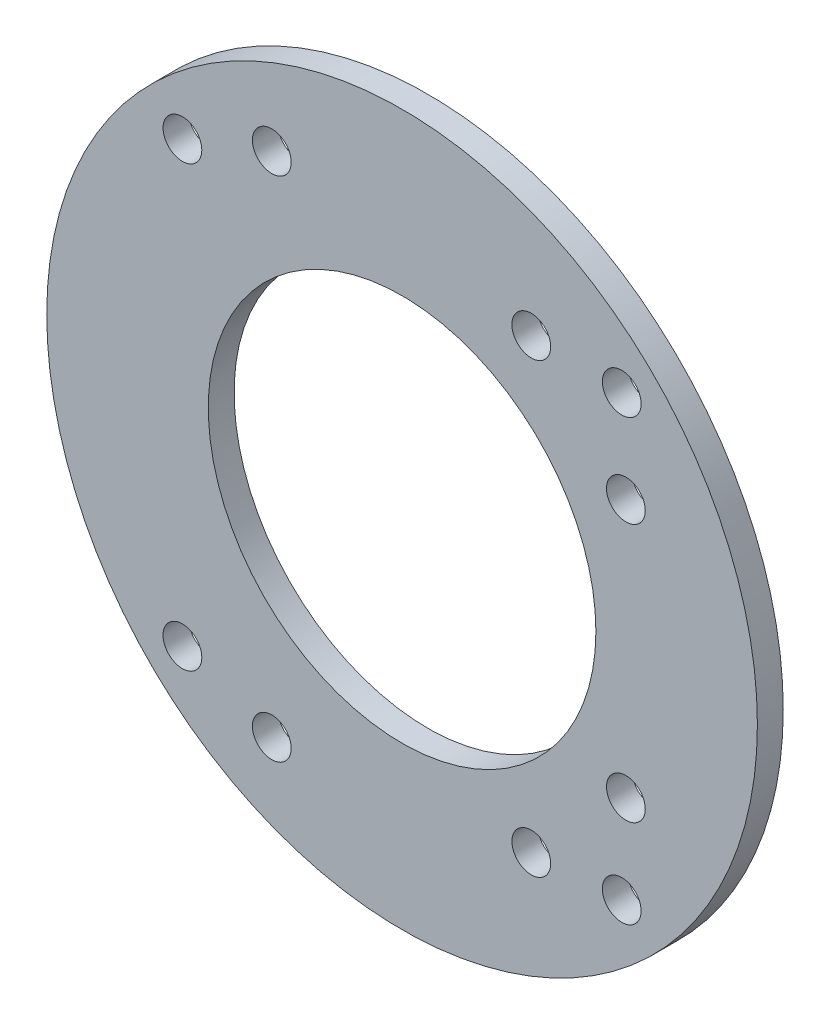
ISO-10303-21;
HEADER;
FILE_DESCRIPTION(('STEP AP214'),'2;1');
FILE_NAME('part.step','',(''),(''),'','','');
FILE_SCHEMA(('AUTOMOTIVE_DESIGN { 1 0 10303 214 1 1 1 1 }'));
ENDSEC;
DATA;
#1=APPLICATION_CONTEXT('core data for automotive mechanical design processes');
#2=APPLICATION_PROTOCOL_DEFINITION('international standard','automotive_design',2000,#1);
#3=PRODUCT_CONTEXT('',#1,'mechanical');
#4=PRODUCT('Part','Part','',(#3));
#5=PRODUCT_RELATED_PRODUCT_CATEGORY('part','',(#4));
#6=PRODUCT_DEFINITION_FORMATION('','',#4);
#7=PRODUCT_DEFINITION_CONTEXT('part definition',#1,'design');
#8=PRODUCT_DEFINITION('design','',#6,#7);
#9=PRODUCT_DEFINITION_SHAPE('','',#8);
#10=(LENGTH_UNIT() NAMED_UNIT(*) SI_UNIT(.MILLI.,.METRE.));
#11=(NAMED_UNIT(*) PLANE_ANGLE_UNIT() SI_UNIT($,.RADIAN.));
#12=(NAMED_UNIT(*) SI_UNIT($,.STERADIAN.) SOLID_ANGLE_UNIT());
#13=UNCERTAINTY_MEASURE_WITH_UNIT(LENGTH_MEASURE(1.E-05),#10,'distance_accuracy_value','');
#14=(GEOMETRIC_REPRESENTATION_CONTEXT(3) GLOBAL_UNCERTAINTY_ASSIGNED_CONTEXT((#13)) GLOBAL_UNIT_ASSIGNED_CONTEXT((#10,
#11,#12)) REPRESENTATION_CONTEXT('',''));
#15=CARTESIAN_POINT('',(0.,0.,0.));
#16=DIRECTION('',(0.,0.,1.));
#17=DIRECTION('',(1.,0.,0.));
#18=AXIS2_PLACEMENT_3D('',#15,#16,#17);
#19=CARTESIAN_POINT('',(139.99999999915,1.51212375953946E-09,2.));
#20=DIRECTION('',(0.,0.,-1.));
#21=DIRECTION('',(-1.,0.,0.));
#22=AXIS2_PLACEMENT_3D('',#19,#20,#21);
#23=CYLINDRICAL_SURFACE('',#22,27.5);
#24=CARTESIAN_POINT('',(139.99999999915,1.51212375953946E-09,2.));
#25=DIRECTION('',(0.,0.,1.));
#26=DIRECTION('',(1.,0.,0.));
#27=AXIS2_PLACEMENT_3D('',#24,#25,#26);
#28=CIRCLE('',#27,27.5);
#29=CARTESIAN_POINT('',(167.49999999915,1.51212375953946E-09,2.));
#30=VERTEX_POINT('',#29);
#31=EDGE_CURVE('E49',#30,#30,#28,.T.);
#32=ORIENTED_EDGE('',*,*,#31,.F.);
#33=EDGE_LOOP('',(#32));
#34=FACE_BOUND('',#33,.T.);
#35=CARTESIAN_POINT('',(139.99999999915,1.51212375953946E-09,0.));
#36=DIRECTION('',(0.,0.,1.));
#37=DIRECTION('',(1.,0.,0.));
#38=AXIS2_PLACEMENT_3D('',#35,#36,#37);
#39=CIRCLE('',#38,27.5);
#40=CARTESIAN_POINT('',(167.49999999915,1.51212375953946E-09,0.));
#41=VERTEX_POINT('',#40);
#42=EDGE_CURVE('E87',#41,#41,#39,.T.);
#43=ORIENTED_EDGE('',*,*,#42,.T.);
#44=EDGE_LOOP('',(#43));
#45=FACE_BOUND('',#44,.T.);
#46=ADVANCED_FACE('F41',(#34,#45),#23,.T.);
#47=CARTESIAN_POINT('',(129.917171064338,19.6398989681114,2.));
#48=DIRECTION('',(0.,0.,-1.));
#49=DIRECTION('',(-1.,0.,0.));
#50=AXIS2_PLACEMENT_3D('',#47,#48,#49);
#51=CYLINDRICAL_SURFACE('',#50,1.5);
#52=CARTESIAN_POINT('',(129.917171064338,19.6398989681114,2.));
#53=DIRECTION('',(0.,0.,1.));
#54=DIRECTION('',(1.,0.,0.));
#55=AXIS2_PLACEMENT_3D('',#52,#53,#54);
#56=CIRCLE('',#55,1.5);
#57=CARTESIAN_POINT('',(131.417171064338,19.6398989681114,2.));
#58=VERTEX_POINT('',#57);
#59=EDGE_CURVE('E54',#58,#58,#56,.T.);
#60=ORIENTED_EDGE('',*,*,#59,.T.);
#61=EDGE_LOOP('',(#60));
#62=FACE_BOUND('',#61,.T.);
#63=CARTESIAN_POINT('',(129.917171064338,19.6398989681114,0.));
#64=DIRECTION('',(0.,0.,1.));
#65=DIRECTION('',(1.,0.,0.));
#66=AXIS2_PLACEMENT_3D('',#63,#64,#65);
#67=CIRCLE('',#66,1.5);
#68=CARTESIAN_POINT('',(131.417171064338,19.6398989681114,0.));
#69=VERTEX_POINT('',#68);
#70=EDGE_CURVE('E85',#69,#69,#67,.T.);
#71=ORIENTED_EDGE('',*,*,#70,.F.);
#72=EDGE_LOOP('',(#71));
#73=FACE_BOUND('',#72,.T.);
#74=ADVANCED_FACE('F126',(#62,#73),#51,.F.);
#75=CARTESIAN_POINT('',(129.917171064338,-19.6398989651158,2.));
#76=DIRECTION('',(0.,0.,-1.));
#77=DIRECTION('',(-1.,0.,0.));
#78=AXIS2_PLACEMENT_3D('',#75,#76,#77);
#79=CYLINDRICAL_SURFACE('',#78,1.5);
#80=CARTESIAN_POINT('',(129.917171064338,-19.6398989651158,2.));
#81=DIRECTION('',(0.,0.,1.));
#82=DIRECTION('',(1.,0.,0.));
#83=AXIS2_PLACEMENT_3D('',#80,#81,#82);
#84=CIRCLE('',#83,1.5);
#85=CARTESIAN_POINT('',(131.417171064338,-19.6398989651158,2.));
#86=VERTEX_POINT('',#85);
#87=EDGE_CURVE('E121',#86,#86,#84,.T.);
#88=ORIENTED_EDGE('',*,*,#87,.T.);
#89=EDGE_LOOP('',(#88));
#90=FACE_BOUND('',#89,.T.);
#91=CARTESIAN_POINT('',(129.917171064338,-19.6398989651158,0.));
#92=DIRECTION('',(0.,0.,1.));
#93=DIRECTION('',(1.,0.,0.));
#94=AXIS2_PLACEMENT_3D('',#91,#92,#93);
#95=CIRCLE('',#94,1.5);
#96=CARTESIAN_POINT('',(131.417171064338,-19.6398989651158,0.));
#97=VERTEX_POINT('',#96);
#98=EDGE_CURVE('E82',#97,#97,#95,.T.);
#99=ORIENTED_EDGE('',*,*,#98,.F.);
#100=EDGE_LOOP('',(#99));
#101=FACE_BOUND('',#100,.T.);
#102=ADVANCED_FACE('F144',(#90,#101),#79,.F.);
#103=CARTESIAN_POINT('',(157.320508074845,10.0000000014985,2.));
#104=DIRECTION('',(0.,0.,-1.));
#105=DIRECTION('',(-1.,0.,0.));
#106=AXIS2_PLACEMENT_3D('',#103,#104,#105);
#107=CYLINDRICAL_SURFACE('',#106,1.50000000000003);
#108=CARTESIAN_POINT('',(157.320508074845,10.0000000014985,2.));
#109=DIRECTION('',(0.,0.,1.));
#110=DIRECTION('',(1.,0.,0.));
#111=AXIS2_PLACEMENT_3D('',#108,#109,#110);
#112=CIRCLE('',#111,1.50000000000003);
#113=CARTESIAN_POINT('',(158.820508074845,10.0000000014985,2.));
#114=VERTEX_POINT('',#113);
#115=EDGE_CURVE('E118',#114,#114,#112,.T.);
#116=ORIENTED_EDGE('',*,*,#115,.T.);
#117=EDGE_LOOP('',(#116));
#118=FACE_BOUND('',#117,.T.);
#119=CARTESIAN_POINT('',(157.320508074845,10.0000000014985,0.));
#120=DIRECTION('',(0.,0.,1.));
#121=DIRECTION('',(1.,0.,0.));
#122=AXIS2_PLACEMENT_3D('',#119,#120,#121);
#123=CIRCLE('',#122,1.50000000000003);
#124=CARTESIAN_POINT('',(158.820508074845,10.0000000014985,0.));
#125=VERTEX_POINT('',#124);
#126=EDGE_CURVE('E79',#125,#125,#123,.T.);
#127=ORIENTED_EDGE('',*,*,#126,.F.);
#128=EDGE_LOOP('',(#127));
#129=FACE_BOUND('',#128,.T.);
#130=ADVANCED_FACE('F151',(#118,#129),#107,.F.);
#131=CARTESIAN_POINT('',(156.99999999915,17.0000000015121,2.));
#132=DIRECTION('',(0.,0.,-1.));
#133=DIRECTION('',(-1.,0.,0.));
#134=AXIS2_PLACEMENT_3D('',#131,#132,#133);
#135=CYLINDRICAL_SURFACE('',#134,1.5);
#136=CARTESIAN_POINT('',(156.99999999915,17.0000000015121,2.));
#137=DIRECTION('',(0.,0.,1.));
#138=DIRECTION('',(1.,0.,0.));
#139=AXIS2_PLACEMENT_3D('',#136,#137,#138);
#140=CIRCLE('',#139,1.5);
#141=CARTESIAN_POINT('',(158.49999999915,17.0000000015121,2.));
#142=VERTEX_POINT('',#141);
#143=EDGE_CURVE('E115',#142,#142,#140,.T.);
#144=ORIENTED_EDGE('',*,*,#143,.T.);
#145=EDGE_LOOP('',(#144));
#146=FACE_BOUND('',#145,.T.);
#147=CARTESIAN_POINT('',(156.99999999915,17.0000000015121,0.));
#148=DIRECTION('',(0.,0.,1.));
#149=DIRECTION('',(1.,0.,0.));
#150=AXIS2_PLACEMENT_3D('',#147,#148,#149);
#151=CIRCLE('',#150,1.5);
#152=CARTESIAN_POINT('',(158.49999999915,17.0000000015121,0.));
#153=VERTEX_POINT('',#152);
#154=EDGE_CURVE('E76',#153,#153,#151,.T.);
#155=ORIENTED_EDGE('',*,*,#154,.F.);
#156=EDGE_LOOP('',(#155));
#157=FACE_BOUND('',#156,.T.);
#158=ADVANCED_FACE('F155',(#146,#157),#135,.F.);
#159=CARTESIAN_POINT('',(149.999999999156,17.320508077187,2.));
#160=DIRECTION('',(0.,0.,-1.));
#161=DIRECTION('',(-1.,0.,0.));
#162=AXIS2_PLACEMENT_3D('',#159,#160,#161);
#163=CYLINDRICAL_SURFACE('',#162,1.5);
#164=CARTESIAN_POINT('',(149.999999999156,17.320508077187,2.));
#165=DIRECTION('',(0.,0.,1.));
#166=DIRECTION('',(1.,0.,0.));
#167=AXIS2_PLACEMENT_3D('',#164,#165,#166);
#168=CIRCLE('',#167,1.5);
#169=CARTESIAN_POINT('',(151.499999999156,17.320508077187,2.));
#170=VERTEX_POINT('',#169);
#171=EDGE_CURVE('E112',#170,#170,#168,.T.);
#172=ORIENTED_EDGE('',*,*,#171,.T.);
#173=EDGE_LOOP('',(#172));
#174=FACE_BOUND('',#173,.T.);
#175=CARTESIAN_POINT('',(149.999999999156,17.320508077187,0.));
#176=DIRECTION('',(0.,0.,1.));
#177=DIRECTION('',(1.,0.,0.));
#178=AXIS2_PLACEMENT_3D('',#175,#176,#177);
#179=CIRCLE('',#178,1.5);
#180=CARTESIAN_POINT('',(151.499999999156,17.320508077187,0.));
#181=VERTEX_POINT('',#180);
#182=EDGE_CURVE('E73',#181,#181,#179,.T.);
#183=ORIENTED_EDGE('',*,*,#182,.F.);
#184=EDGE_LOOP('',(#183));
#185=FACE_BOUND('',#184,.T.);
#186=ADVANCED_FACE('F159',(#174,#185),#163,.F.);
#187=CARTESIAN_POINT('',(122.99999999915,17.0000000015121,2.));
#188=DIRECTION('',(0.,0.,-1.));
#189=DIRECTION('',(-1.,0.,0.));
#190=AXIS2_PLACEMENT_3D('',#187,#188,#189);
#191=CYLINDRICAL_SURFACE('',#190,1.5);
#192=CARTESIAN_POINT('',(122.99999999915,17.0000000015121,2.));
#193=DIRECTION('',(0.,0.,1.));
#194=DIRECTION('',(1.,0.,0.));
#195=AXIS2_PLACEMENT_3D('',#192,#193,#194);
#196=CIRCLE('',#195,1.5);
#197=CARTESIAN_POINT('',(124.49999999915,17.0000000015121,2.));
#198=VERTEX_POINT('',#197);
#199=EDGE_CURVE('E109',#198,#198,#196,.T.);
#200=ORIENTED_EDGE('',*,*,#199,.T.);
#201=EDGE_LOOP('',(#200));
#202=FACE_BOUND('',#201,.T.);
#203=CARTESIAN_POINT('',(122.99999999915,17.0000000015121,0.));
#204=DIRECTION('',(0.,0.,1.));
#205=DIRECTION('',(1.,0.,0.));
#206=AXIS2_PLACEMENT_3D('',#203,#204,#205);
#207=CIRCLE('',#206,1.5);
#208=CARTESIAN_POINT('',(124.49999999915,17.0000000015121,0.));
#209=VERTEX_POINT('',#208);
#210=EDGE_CURVE('E70',#209,#209,#207,.T.);
#211=ORIENTED_EDGE('',*,*,#210,.F.);
#212=EDGE_LOOP('',(#211));
#213=FACE_BOUND('',#212,.T.);
#214=ADVANCED_FACE('F163',(#202,#213),#191,.F.);
#215=CARTESIAN_POINT('',(122.99999999915,-16.9999999984879,2.));
#216=DIRECTION('',(0.,0.,-1.));
#217=DIRECTION('',(-1.,0.,0.));
#218=AXIS2_PLACEMENT_3D('',#215,#216,#217);
#219=CYLINDRICAL_SURFACE('',#218,1.5);
#220=CARTESIAN_POINT('',(122.99999999915,-16.9999999984879,2.));
#221=DIRECTION('',(0.,0.,1.));
#222=DIRECTION('',(1.,0.,0.));
#223=AXIS2_PLACEMENT_3D('',#220,#221,#222);
#224=CIRCLE('',#223,1.5);
#225=CARTESIAN_POINT('',(124.49999999915,-16.9999999984879,2.));
#226=VERTEX_POINT('',#225);
#227=EDGE_CURVE('E106',#226,#226,#224,.T.);
#228=ORIENTED_EDGE('',*,*,#227,.T.);
#229=EDGE_LOOP('',(#228));
#230=FACE_BOUND('',#229,.T.);
#231=CARTESIAN_POINT('',(122.99999999915,-16.9999999984879,0.));
#232=DIRECTION('',(0.,0.,1.));
#233=DIRECTION('',(1.,0.,0.));
#234=AXIS2_PLACEMENT_3D('',#231,#232,#233);
#235=CIRCLE('',#234,1.5);
#236=CARTESIAN_POINT('',(124.49999999915,-16.9999999984879,0.));
#237=VERTEX_POINT('',#236);
#238=EDGE_CURVE('E67',#237,#237,#235,.T.);
#239=ORIENTED_EDGE('',*,*,#238,.F.);
#240=EDGE_LOOP('',(#239));
#241=FACE_BOUND('',#240,.T.);
#242=ADVANCED_FACE('F167',(#230,#241),#219,.F.);
#243=CARTESIAN_POINT('',(149.999999999158,-17.3205080741906,2.));
#244=DIRECTION('',(0.,0.,-1.));
#245=DIRECTION('',(-1.,0.,0.));
#246=AXIS2_PLACEMENT_3D('',#243,#244,#245);
#247=CYLINDRICAL_SURFACE('',#246,1.50000000000003);
#248=CARTESIAN_POINT('',(149.999999999158,-17.3205080741906,2.));
#249=DIRECTION('',(0.,0.,1.));
#250=DIRECTION('',(1.,0.,0.));
#251=AXIS2_PLACEMENT_3D('',#248,#249,#250);
#252=CIRCLE('',#251,1.50000000000003);
#253=CARTESIAN_POINT('',(151.499999999158,-17.3205080741906,2.));
#254=VERTEX_POINT('',#253);
#255=EDGE_CURVE('E101',#254,#254,#252,.T.);
#256=ORIENTED_EDGE('',*,*,#255,.T.);
#257=EDGE_LOOP('',(#256));
#258=FACE_BOUND('',#257,.T.);
#259=CARTESIAN_POINT('',(149.999999999158,-17.3205080741906,0.));
#260=DIRECTION('',(0.,0.,1.));
#261=DIRECTION('',(1.,0.,0.));
#262=AXIS2_PLACEMENT_3D('',#259,#260,#261);
#263=CIRCLE('',#262,1.50000000000003);
#264=CARTESIAN_POINT('',(151.499999999158,-17.3205080741906,0.));
#265=VERTEX_POINT('',#264);
#266=EDGE_CURVE('E64',#265,#265,#263,.T.);
#267=ORIENTED_EDGE('',*,*,#266,.F.);
#268=EDGE_LOOP('',(#267));
#269=FACE_BOUND('',#268,.T.);
#270=ADVANCED_FACE('F171',(#258,#269),#247,.F.);
#271=CARTESIAN_POINT('',(156.99999999915,-16.9999999984879,2.));
#272=DIRECTION('',(0.,0.,-1.));
#273=DIRECTION('',(-1.,0.,0.));
#274=AXIS2_PLACEMENT_3D('',#271,#272,#273);
#275=CYLINDRICAL_SURFACE('',#274,1.5);
#276=CARTESIAN_POINT('',(156.99999999915,-16.9999999984879,2.));
#277=DIRECTION('',(0.,0.,1.));
#278=DIRECTION('',(1.,0.,0.));
#279=AXIS2_PLACEMENT_3D('',#276,#277,#278);
#280=CIRCLE('',#279,1.5);
#281=CARTESIAN_POINT('',(158.49999999915,-16.9999999984879,2.));
#282=VERTEX_POINT('',#281);
#283=EDGE_CURVE('E96',#282,#282,#280,.T.);
#284=ORIENTED_EDGE('',*,*,#283,.T.);
#285=EDGE_LOOP('',(#284));
#286=FACE_BOUND('',#285,.T.);
#287=CARTESIAN_POINT('',(156.99999999915,-16.9999999984879,0.));
#288=DIRECTION('',(0.,0.,1.));
#289=DIRECTION('',(1.,0.,0.));
#290=AXIS2_PLACEMENT_3D('',#287,#288,#289);
#291=CIRCLE('',#290,1.5);
#292=CARTESIAN_POINT('',(158.49999999915,-16.9999999984879,0.));
#293=VERTEX_POINT('',#292);
#294=EDGE_CURVE('E61',#293,#293,#291,.T.);
#295=ORIENTED_EDGE('',*,*,#294,.F.);
#296=EDGE_LOOP('',(#295));
#297=FACE_BOUND('',#296,.T.);
#298=ADVANCED_FACE('F174',(#286,#297),#275,.F.);
#299=CARTESIAN_POINT('',(157.320508074846,-9.99999999850157,2.));
#300=DIRECTION('',(0.,0.,-1.));
#301=DIRECTION('',(-1.,0.,0.));
#302=AXIS2_PLACEMENT_3D('',#299,#300,#301);
#303=CYLINDRICAL_SURFACE('',#302,1.5);
#304=CARTESIAN_POINT('',(157.320508074846,-9.99999999850157,2.));
#305=DIRECTION('',(0.,0.,1.));
#306=DIRECTION('',(1.,0.,0.));
#307=AXIS2_PLACEMENT_3D('',#304,#305,#306);
#308=CIRCLE('',#307,1.5);
#309=CARTESIAN_POINT('',(158.820508074846,-9.99999999850157,2.));
#310=VERTEX_POINT('',#309);
#311=EDGE_CURVE('E92',#310,#310,#308,.T.);
#312=ORIENTED_EDGE('',*,*,#311,.T.);
#313=EDGE_LOOP('',(#312));
#314=FACE_BOUND('',#313,.T.);
#315=CARTESIAN_POINT('',(157.320508074846,-9.99999999850157,0.));
#316=DIRECTION('',(0.,0.,1.));
#317=DIRECTION('',(1.,0.,0.));
#318=AXIS2_PLACEMENT_3D('',#315,#316,#317);
#319=CIRCLE('',#318,1.5);
#320=CARTESIAN_POINT('',(158.820508074846,-9.99999999850157,0.));
#321=VERTEX_POINT('',#320);
#322=EDGE_CURVE('E58',#321,#321,#319,.T.);
#323=ORIENTED_EDGE('',*,*,#322,.F.);
#324=EDGE_LOOP('',(#323));
#325=FACE_BOUND('',#324,.T.);
#326=ADVANCED_FACE('F43',(#314,#325),#303,.F.);
#327=CARTESIAN_POINT('',(139.99999999915,1.51212375953946E-09,2.));
#328=DIRECTION('',(0.,0.,-1.));
#329=DIRECTION('',(-1.,0.,0.));
#330=AXIS2_PLACEMENT_3D('',#327,#328,#329);
#331=CYLINDRICAL_SURFACE('',#330,15.);
#332=CARTESIAN_POINT('',(139.99999999915,1.51212375953946E-09,2.));
#333=DIRECTION('',(0.,0.,1.));
#334=DIRECTION('',(1.,0.,0.));
#335=AXIS2_PLACEMENT_3D('',#332,#333,#334);
#336=CIRCLE('',#335,15.);
#337=CARTESIAN_POINT('',(154.99999999915,1.51212375953946E-09,2.));
#338=VERTEX_POINT('',#337);
#339=EDGE_CURVE('E10',#338,#338,#336,.T.);
#340=ORIENTED_EDGE('',*,*,#339,.T.);
#341=EDGE_LOOP('',(#340));
#342=FACE_BOUND('',#341,.T.);
#343=CARTESIAN_POINT('',(139.99999999915,1.51212375953946E-09,0.));
#344=DIRECTION('',(0.,0.,1.));
#345=DIRECTION('',(1.,0.,0.));
#346=AXIS2_PLACEMENT_3D('',#343,#344,#345);
#347=CIRCLE('',#346,15.);
#348=CARTESIAN_POINT('',(154.99999999915,1.51212375953946E-09,0.));
#349=VERTEX_POINT('',#348);
#350=EDGE_CURVE('E45',#349,#349,#347,.T.);
#351=ORIENTED_EDGE('',*,*,#350,.F.);
#352=EDGE_LOOP('',(#351));
#353=FACE_BOUND('',#352,.T.);
#354=ADVANCED_FACE('F133',(#342,#353),#331,.F.);
#355=CARTESIAN_POINT('',(0.,0.,2.));
#356=DIRECTION('',(0.,0.,1.));
#357=DIRECTION('',(1.,0.,0.));
#358=AXIS2_PLACEMENT_3D('',#355,#356,#357);
#359=PLANE('',#358);
#360=ORIENTED_EDGE('',*,*,#311,.F.);
#361=EDGE_LOOP('',(#360));
#362=FACE_BOUND('',#361,.T.);
#363=ORIENTED_EDGE('',*,*,#283,.F.);
#364=EDGE_LOOP('',(#363));
#365=FACE_BOUND('',#364,.T.);
#366=ORIENTED_EDGE('',*,*,#255,.F.);
#367=EDGE_LOOP('',(#366));
#368=FACE_BOUND('',#367,.T.);
#369=ORIENTED_EDGE('',*,*,#227,.F.);
#370=EDGE_LOOP('',(#369));
#371=FACE_BOUND('',#370,.T.);
#372=ORIENTED_EDGE('',*,*,#199,.F.);
#373=EDGE_LOOP('',(#372));
#374=FACE_BOUND('',#373,.T.);
#375=ORIENTED_EDGE('',*,*,#171,.F.);
#376=EDGE_LOOP('',(#375));
#377=FACE_BOUND('',#376,.T.);
#378=ORIENTED_EDGE('',*,*,#143,.F.);
#379=EDGE_LOOP('',(#378));
#380=FACE_BOUND('',#379,.T.);
#381=ORIENTED_EDGE('',*,*,#115,.F.);
#382=EDGE_LOOP('',(#381));
#383=FACE_BOUND('',#382,.T.);
#384=ORIENTED_EDGE('',*,*,#87,.F.);
#385=EDGE_LOOP('',(#384));
#386=FACE_BOUND('',#385,.T.);
#387=ORIENTED_EDGE('',*,*,#59,.F.);
#388=EDGE_LOOP('',(#387));
#389=FACE_BOUND('',#388,.T.);
#390=ORIENTED_EDGE('',*,*,#31,.T.);
#391=EDGE_LOOP('',(#390));
#392=FACE_BOUND('',#391,.T.);
#393=ORIENTED_EDGE('',*,*,#339,.F.);
#394=EDGE_LOOP('',(#393));
#395=FACE_BOUND('',#394,.T.);
#396=ADVANCED_FACE('F129',(#362,#365,#368,#371,#374,#377,#380,#383,#386,#389,#392,#395),#359,.T.);
#397=CARTESIAN_POINT('',(0.,0.,0.));
#398=DIRECTION('',(0.,0.,1.));
#399=DIRECTION('',(1.,0.,0.));
#400=AXIS2_PLACEMENT_3D('',#397,#398,#399);
#401=PLANE('',#400);
#402=ORIENTED_EDGE('',*,*,#322,.T.);
#403=EDGE_LOOP('',(#402));
#404=FACE_BOUND('',#403,.T.);
#405=ORIENTED_EDGE('',*,*,#294,.T.);
#406=EDGE_LOOP('',(#405));
#407=FACE_BOUND('',#406,.T.);
#408=ORIENTED_EDGE('',*,*,#266,.T.);
#409=EDGE_LOOP('',(#408));
#410=FACE_BOUND('',#409,.T.);
#411=ORIENTED_EDGE('',*,*,#238,.T.);
#412=EDGE_LOOP('',(#411));
#413=FACE_BOUND('',#412,.T.);
#414=ORIENTED_EDGE('',*,*,#210,.T.);
#415=EDGE_LOOP('',(#414));
#416=FACE_BOUND('',#415,.T.);
#417=ORIENTED_EDGE('',*,*,#182,.T.);
#418=EDGE_LOOP('',(#417));
#419=FACE_BOUND('',#418,.T.);
#420=ORIENTED_EDGE('',*,*,#154,.T.);
#421=EDGE_LOOP('',(#420));
#422=FACE_BOUND('',#421,.T.);
#423=ORIENTED_EDGE('',*,*,#126,.T.);
#424=EDGE_LOOP('',(#423));
#425=FACE_BOUND('',#424,.T.);
#426=ORIENTED_EDGE('',*,*,#98,.T.);
#427=EDGE_LOOP('',(#426));
#428=FACE_BOUND('',#427,.T.);
#429=ORIENTED_EDGE('',*,*,#70,.T.);
#430=EDGE_LOOP('',(#429));
#431=FACE_BOUND('',#430,.T.);
#432=ORIENTED_EDGE('',*,*,#42,.F.);
#433=EDGE_LOOP('',(#432));
#434=FACE_BOUND('',#433,.T.);
#435=ORIENTED_EDGE('',*,*,#350,.T.);
#436=EDGE_LOOP('',(#435));
#437=FACE_BOUND('',#436,.T.);
#438=ADVANCED_FACE('F132',(#404,#407,#410,#413,#416,#419,#422,#425,#428,#431,#434,#437),#401,.F.);
#439=CLOSED_SHELL('',(#46,#74,#102,#130,#158,#186,#214,#242,#270,#298,#326,#354,#396,#438));
#440=MANIFOLD_SOLID_BREP('B2',#439);
#441=ADVANCED_BREP_SHAPE_REPRESENTATION('',(#18,#440),#14);
#442=SHAPE_DEFINITION_REPRESENTATION(#9,#441);
ENDSEC;
END-ISO-10303-21;
